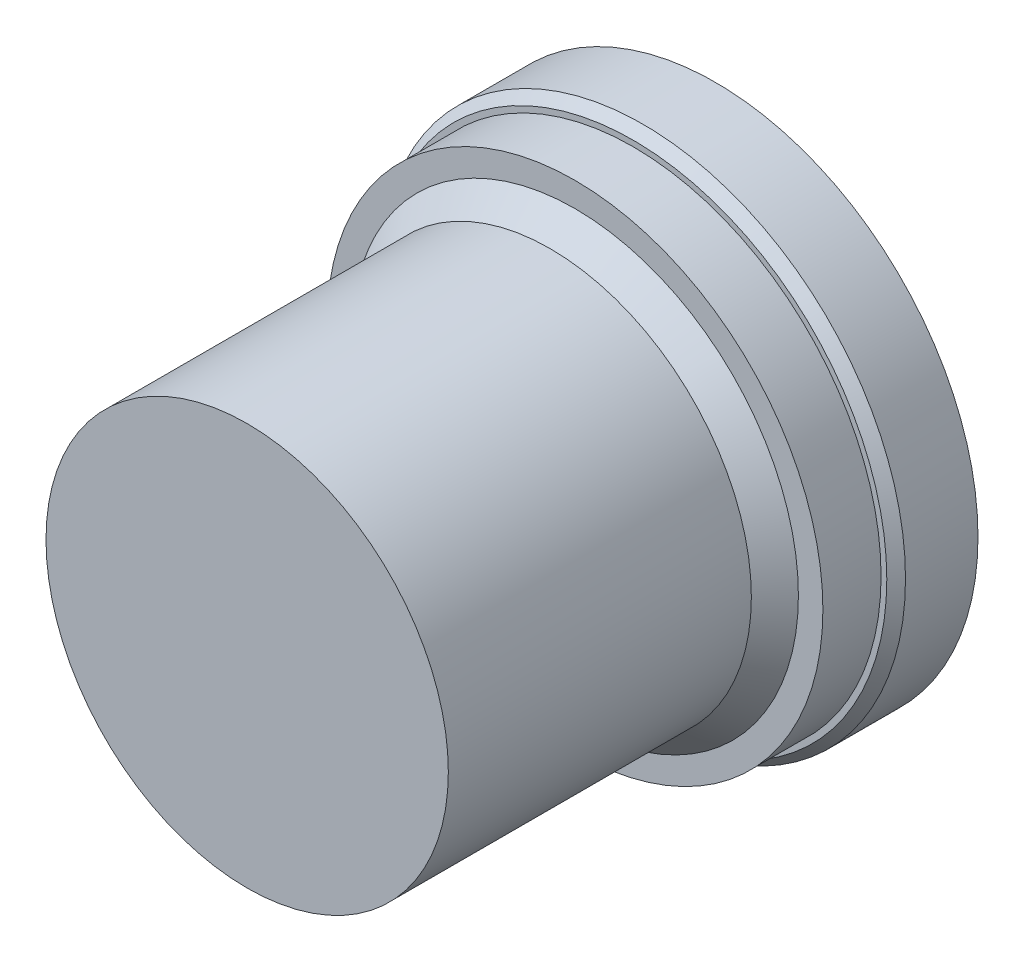
ISO-10303-21;
HEADER;
FILE_DESCRIPTION(('STEP AP214'),'2;1');
FILE_NAME('part.step','',(''),(''),'','','');
FILE_SCHEMA(('AUTOMOTIVE_DESIGN { 1 0 10303 214 1 1 1 1 }'));
ENDSEC;
DATA;
#1=APPLICATION_CONTEXT('core data for automotive mechanical design processes');
#2=APPLICATION_PROTOCOL_DEFINITION('international standard','automotive_design',2000,#1);
#3=PRODUCT_CONTEXT('',#1,'mechanical');
#4=PRODUCT('Part','Part','',(#3));
#5=PRODUCT_RELATED_PRODUCT_CATEGORY('part','',(#4));
#6=PRODUCT_DEFINITION_FORMATION('','',#4);
#7=PRODUCT_DEFINITION_CONTEXT('part definition',#1,'design');
#8=PRODUCT_DEFINITION('design','',#6,#7);
#9=PRODUCT_DEFINITION_SHAPE('','',#8);
#10=(LENGTH_UNIT() NAMED_UNIT(*) SI_UNIT(.MILLI.,.METRE.));
#11=(NAMED_UNIT(*) PLANE_ANGLE_UNIT() SI_UNIT($,.RADIAN.));
#12=(NAMED_UNIT(*) SI_UNIT($,.STERADIAN.) SOLID_ANGLE_UNIT());
#13=UNCERTAINTY_MEASURE_WITH_UNIT(LENGTH_MEASURE(1.E-05),#10,'distance_accuracy_value','');
#14=(GEOMETRIC_REPRESENTATION_CONTEXT(3) GLOBAL_UNCERTAINTY_ASSIGNED_CONTEXT((#13)) GLOBAL_UNIT_ASSIGNED_CONTEXT((#10,
#11,#12)) REPRESENTATION_CONTEXT('',''));
#15=CARTESIAN_POINT('',(0.,0.,0.));
#16=DIRECTION('',(0.,0.,1.));
#17=DIRECTION('',(1.,0.,0.));
#18=AXIS2_PLACEMENT_3D('',#15,#16,#17);
#19=CARTESIAN_POINT('',(0.,0.,-40.8276724528302));
#20=DIRECTION('',(0.,0.,1.));
#21=DIRECTION('',(1.,0.,0.));
#22=AXIS2_PLACEMENT_3D('',#19,#20,#21);
#23=PLANE('',#22);
#24=CARTESIAN_POINT('',(0.,0.,-40.8276724528302));
#25=DIRECTION('',(0.,0.,1.));
#26=DIRECTION('',(1.,0.,0.));
#27=AXIS2_PLACEMENT_3D('',#24,#25,#26);
#28=CIRCLE('',#27,20.9677);
#29=CARTESIAN_POINT('',(20.9677,0.,-40.8276724528302));
#30=VERTEX_POINT('',#29);
#31=EDGE_CURVE('E10',#30,#30,#28,.T.);
#32=ORIENTED_EDGE('',*,*,#31,.F.);
#33=EDGE_LOOP('',(#32));
#34=FACE_BOUND('',#33,.T.);
#35=ADVANCED_FACE('F30',(#34),#23,.F.);
#36=CARTESIAN_POINT('',(0.,0.,72.6352777358491));
#37=DIRECTION('',(0.,0.,1.));
#38=DIRECTION('',(1.,0.,0.));
#39=AXIS2_PLACEMENT_3D('',#36,#37,#38);
#40=CYLINDRICAL_SURFACE('',#39,20.9677);
#41=CARTESIAN_POINT('',(0.,0.,-35.0364724528302));
#42=DIRECTION('',(0.,0.,1.));
#43=DIRECTION('',(1.,0.,0.));
#44=AXIS2_PLACEMENT_3D('',#41,#42,#43);
#45=CIRCLE('',#44,20.9677);
#46=CARTESIAN_POINT('',(20.9677,0.,-35.0364724528302));
#47=VERTEX_POINT('',#46);
#48=EDGE_CURVE('E36',#47,#47,#45,.T.);
#49=ORIENTED_EDGE('',*,*,#48,.F.);
#50=EDGE_LOOP('',(#49));
#51=FACE_BOUND('',#50,.T.);
#52=ORIENTED_EDGE('',*,*,#31,.T.);
#53=EDGE_LOOP('',(#52));
#54=FACE_BOUND('',#53,.T.);
#55=ADVANCED_FACE('F96',(#51,#54),#40,.T.);
#56=CARTESIAN_POINT('',(0.,0.,-35.0364724528302));
#57=DIRECTION('',(0.,0.,-1.));
#58=DIRECTION('',(-1.,0.,0.));
#59=AXIS2_PLACEMENT_3D('',#56,#57,#58);
#60=CONICAL_SURFACE('',#59,20.9677,0.731396663021472);
#61=CARTESIAN_POINT('',(0.,0.,-34.2490724528302));
#62=DIRECTION('',(0.,0.,1.));
#63=DIRECTION('',(1.,0.,0.));
#64=AXIS2_PLACEMENT_3D('',#61,#62,#63);
#65=CIRCLE('',#64,20.261058974359);
#66=CARTESIAN_POINT('',(20.261058974359,0.,-34.2490724528302));
#67=VERTEX_POINT('',#66);
#68=EDGE_CURVE('E40',#67,#67,#65,.T.);
#69=ORIENTED_EDGE('',*,*,#68,.F.);
#70=EDGE_LOOP('',(#69));
#71=FACE_BOUND('',#70,.T.);
#72=ORIENTED_EDGE('',*,*,#48,.T.);
#73=EDGE_LOOP('',(#72));
#74=FACE_BOUND('',#73,.T.);
#75=ADVANCED_FACE('F91',(#71,#74),#60,.T.);
#76=CARTESIAN_POINT('',(0.,20.261058974359,-34.2490724528302));
#77=DIRECTION('',(0.,0.,-1.));
#78=DIRECTION('',(-1.,0.,0.));
#79=AXIS2_PLACEMENT_3D('',#76,#77,#78);
#80=PLANE('',#79);
#81=CARTESIAN_POINT('',(0.,0.,-34.2490724528302));
#82=DIRECTION('',(0.,0.,1.));
#83=DIRECTION('',(1.,0.,0.));
#84=AXIS2_PLACEMENT_3D('',#81,#82,#83);
#85=CIRCLE('',#84,19.803858974359);
#86=CARTESIAN_POINT('',(19.803858974359,0.,-34.2490724528302));
#87=VERTEX_POINT('',#86);
#88=EDGE_CURVE('E44',#87,#87,#85,.T.);
#89=ORIENTED_EDGE('',*,*,#88,.F.);
#90=EDGE_LOOP('',(#89));
#91=FACE_BOUND('',#90,.T.);
#92=ORIENTED_EDGE('',*,*,#68,.T.);
#93=EDGE_LOOP('',(#92));
#94=FACE_BOUND('',#93,.T.);
#95=ADVANCED_FACE('F85',(#91,#94),#80,.F.);
#96=CARTESIAN_POINT('',(0.,0.,72.6352777358491));
#97=DIRECTION('',(0.,0.,1.));
#98=DIRECTION('',(1.,0.,0.));
#99=AXIS2_PLACEMENT_3D('',#96,#97,#98);
#100=CYLINDRICAL_SURFACE('',#99,19.803858974359);
#101=CARTESIAN_POINT('',(0.,0.,-29.6008724528302));
#102=DIRECTION('',(0.,0.,1.));
#103=DIRECTION('',(1.,0.,0.));
#104=AXIS2_PLACEMENT_3D('',#101,#102,#103);
#105=CIRCLE('',#104,19.803858974359);
#106=CARTESIAN_POINT('',(19.803858974359,0.,-29.6008724528302));
#107=VERTEX_POINT('',#106);
#108=EDGE_CURVE('E49',#107,#107,#105,.T.);
#109=ORIENTED_EDGE('',*,*,#108,.F.);
#110=EDGE_LOOP('',(#109));
#111=FACE_BOUND('',#110,.T.);
#112=ORIENTED_EDGE('',*,*,#88,.T.);
#113=EDGE_LOOP('',(#112));
#114=FACE_BOUND('',#113,.T.);
#115=ADVANCED_FACE('F79',(#111,#114),#100,.T.);
#116=CARTESIAN_POINT('',(0.,19.803858974359,-29.6008724528302));
#117=DIRECTION('',(0.,0.,-1.));
#118=DIRECTION('',(-1.,0.,0.));
#119=AXIS2_PLACEMENT_3D('',#116,#117,#118);
#120=PLANE('',#119);
#121=CARTESIAN_POINT('',(0.,0.,-29.6008724528302));
#122=DIRECTION('',(0.,0.,1.));
#123=DIRECTION('',(1.,0.,0.));
#124=AXIS2_PLACEMENT_3D('',#121,#122,#123);
#125=CIRCLE('',#124,17.848058974359);
#126=CARTESIAN_POINT('',(17.848058974359,0.,-29.6008724528302));
#127=VERTEX_POINT('',#126);
#128=EDGE_CURVE('E52',#127,#127,#125,.T.);
#129=ORIENTED_EDGE('',*,*,#128,.F.);
#130=EDGE_LOOP('',(#129));
#131=FACE_BOUND('',#130,.T.);
#132=ORIENTED_EDGE('',*,*,#108,.T.);
#133=EDGE_LOOP('',(#132));
#134=FACE_BOUND('',#133,.T.);
#135=ADVANCED_FACE('F73',(#131,#134),#120,.F.);
#136=CARTESIAN_POINT('',(0.,0.,-29.6008724528302));
#137=DIRECTION('',(0.,0.,-1.));
#138=DIRECTION('',(-1.,0.,0.));
#139=AXIS2_PLACEMENT_3D('',#136,#137,#138);
#140=CONICAL_SURFACE('',#139,17.848058974359,0.73139666302148);
#141=CARTESIAN_POINT('',(0.,0.,-27.6196724528302));
#142=DIRECTION('',(0.,0.,1.));
#143=DIRECTION('',(1.,0.,0.));
#144=AXIS2_PLACEMENT_3D('',#141,#142,#143);
#145=CIRCLE('',#144,16.070058974359);
#146=CARTESIAN_POINT('',(16.070058974359,0.,-27.6196724528302));
#147=VERTEX_POINT('',#146);
#148=EDGE_CURVE('E55',#147,#147,#145,.T.);
#149=ORIENTED_EDGE('',*,*,#148,.F.);
#150=EDGE_LOOP('',(#149));
#151=FACE_BOUND('',#150,.T.);
#152=ORIENTED_EDGE('',*,*,#128,.T.);
#153=EDGE_LOOP('',(#152));
#154=FACE_BOUND('',#153,.T.);
#155=ADVANCED_FACE('F67',(#151,#154),#140,.T.);
#156=CARTESIAN_POINT('',(0.,0.,72.6352777358491));
#157=DIRECTION('',(0.,0.,1.));
#158=DIRECTION('',(1.,0.,0.));
#159=AXIS2_PLACEMENT_3D('',#156,#157,#158);
#160=CYLINDRICAL_SURFACE('',#159,16.070058974359);
#161=CARTESIAN_POINT('',(0.,0.,-3.41347245283018));
#162=DIRECTION('',(0.,0.,1.));
#163=DIRECTION('',(1.,0.,0.));
#164=AXIS2_PLACEMENT_3D('',#161,#162,#163);
#165=CIRCLE('',#164,16.070058974359);
#166=CARTESIAN_POINT('',(16.070058974359,0.,-3.41347245283018));
#167=VERTEX_POINT('',#166);
#168=EDGE_CURVE('E58',#167,#167,#165,.T.);
#169=ORIENTED_EDGE('',*,*,#168,.F.);
#170=EDGE_LOOP('',(#169));
#171=FACE_BOUND('',#170,.T.);
#172=ORIENTED_EDGE('',*,*,#148,.T.);
#173=EDGE_LOOP('',(#172));
#174=FACE_BOUND('',#173,.T.);
#175=ADVANCED_FACE('F64',(#171,#174),#160,.T.);
#176=CARTESIAN_POINT('',(0.,16.070058974359,-3.41347245283018));
#177=DIRECTION('',(0.,0.,-1.));
#178=DIRECTION('',(-1.,0.,0.));
#179=AXIS2_PLACEMENT_3D('',#176,#177,#178);
#180=PLANE('',#179);
#181=ORIENTED_EDGE('',*,*,#168,.T.);
#182=EDGE_LOOP('',(#181));
#183=FACE_BOUND('',#182,.T.);
#184=ADVANCED_FACE('F62',(#183),#180,.F.);
#185=CLOSED_SHELL('',(#35,#55,#75,#95,#115,#135,#155,#175,#184));
#186=MANIFOLD_SOLID_BREP('B2',#185);
#187=ADVANCED_BREP_SHAPE_REPRESENTATION('',(#18,#186),#14);
#188=SHAPE_DEFINITION_REPRESENTATION(#9,#187);
ENDSEC;
END-ISO-10303-21;
